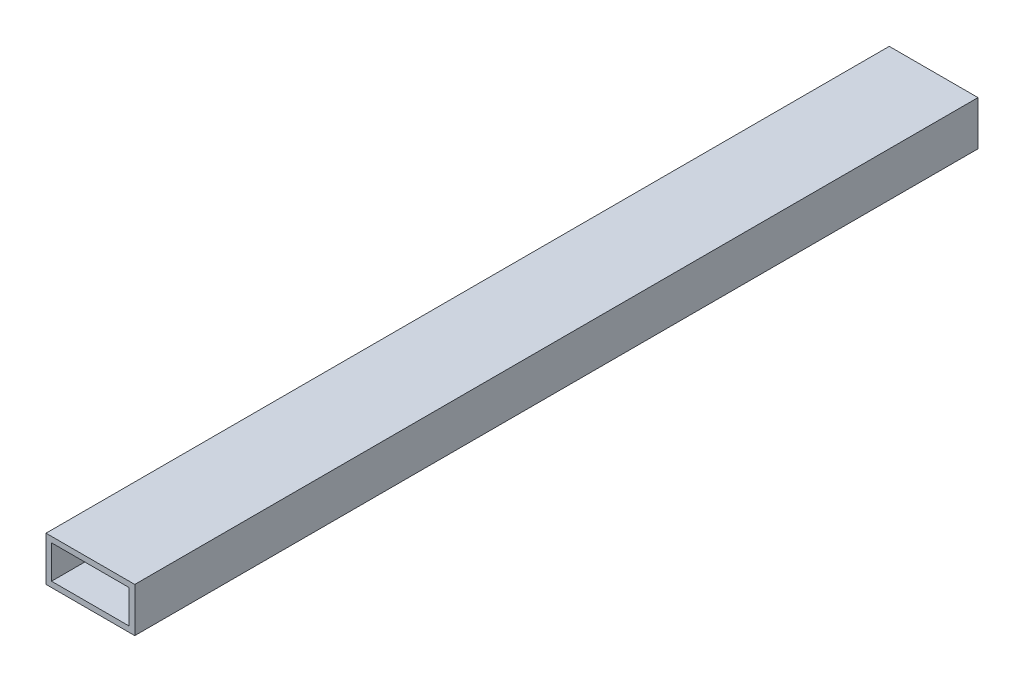
ISO-10303-21;
HEADER;
FILE_DESCRIPTION(('STEP AP214'),'2;1');
FILE_NAME('part.step','',(''),(''),'','','');
FILE_SCHEMA(('AUTOMOTIVE_DESIGN { 1 0 10303 214 1 1 1 1 }'));
ENDSEC;
DATA;
#1=APPLICATION_CONTEXT('core data for automotive mechanical design processes');
#2=APPLICATION_PROTOCOL_DEFINITION('international standard','automotive_design',2000,#1);
#3=PRODUCT_CONTEXT('',#1,'mechanical');
#4=PRODUCT('Part','Part','',(#3));
#5=PRODUCT_RELATED_PRODUCT_CATEGORY('part','',(#4));
#6=PRODUCT_DEFINITION_FORMATION('','',#4);
#7=PRODUCT_DEFINITION_CONTEXT('part definition',#1,'design');
#8=PRODUCT_DEFINITION('design','',#6,#7);
#9=PRODUCT_DEFINITION_SHAPE('','',#8);
#10=(LENGTH_UNIT() NAMED_UNIT(*) SI_UNIT(.MILLI.,.METRE.));
#11=(NAMED_UNIT(*) PLANE_ANGLE_UNIT() SI_UNIT($,.RADIAN.));
#12=(NAMED_UNIT(*) SI_UNIT($,.STERADIAN.) SOLID_ANGLE_UNIT());
#13=UNCERTAINTY_MEASURE_WITH_UNIT(LENGTH_MEASURE(1.E-05),#10,'distance_accuracy_value','');
#14=(GEOMETRIC_REPRESENTATION_CONTEXT(3) GLOBAL_UNCERTAINTY_ASSIGNED_CONTEXT((#13)) GLOBAL_UNIT_ASSIGNED_CONTEXT((#10,
#11,#12)) REPRESENTATION_CONTEXT('',''));
#15=CARTESIAN_POINT('',(0.,0.,0.));
#16=DIRECTION('',(0.,0.,1.));
#17=DIRECTION('',(1.,0.,0.));
#18=AXIS2_PLACEMENT_3D('',#15,#16,#17);
#19=CARTESIAN_POINT('',(0.,0.,482.6));
#20=DIRECTION('',(0.,0.,-1.));
#21=DIRECTION('',(-1.,0.,0.));
#22=AXIS2_PLACEMENT_3D('',#19,#20,#21);
#23=PLANE('',#22);
#24=DIRECTION('',(0.,-1.,0.));
#25=VECTOR('',#24,1.);
#26=CARTESIAN_POINT('',(0.,0.,482.6));
#27=LINE('',#26,#25);
#28=CARTESIAN_POINT('',(0.,25.4,482.6));
#29=VERTEX_POINT('',#28);
#30=CARTESIAN_POINT('',(0.,0.,482.6));
#31=VERTEX_POINT('',#30);
#32=EDGE_CURVE('E157',#29,#31,#27,.T.);
#33=ORIENTED_EDGE('',*,*,#32,.T.);
#34=DIRECTION('',(1.,0.,0.));
#35=VECTOR('',#34,1.);
#36=CARTESIAN_POINT('',(0.,0.,482.6));
#37=LINE('',#36,#35);
#38=CARTESIAN_POINT('',(50.8,0.,482.6));
#39=VERTEX_POINT('',#38);
#40=EDGE_CURVE('E161',#31,#39,#37,.T.);
#41=ORIENTED_EDGE('',*,*,#40,.T.);
#42=DIRECTION('',(0.,1.,0.));
#43=VECTOR('',#42,1.);
#44=CARTESIAN_POINT('',(50.8,0.,482.6));
#45=LINE('',#44,#43);
#46=CARTESIAN_POINT('',(50.8,25.4,482.6));
#47=VERTEX_POINT('',#46);
#48=EDGE_CURVE('E165',#39,#47,#45,.T.);
#49=ORIENTED_EDGE('',*,*,#48,.T.);
#50=DIRECTION('',(-1.,0.,0.));
#51=VECTOR('',#50,1.);
#52=CARTESIAN_POINT('',(0.,25.4,482.6));
#53=LINE('',#52,#51);
#54=EDGE_CURVE('E168',#47,#29,#53,.T.);
#55=ORIENTED_EDGE('',*,*,#54,.T.);
#56=EDGE_LOOP('',(#33,#41,#49,#55));
#57=FACE_BOUND('',#56,.T.);
#58=DIRECTION('',(0.,-1.,0.));
#59=VECTOR('',#58,1.);
#60=CARTESIAN_POINT('',(3.175,3.175,482.6));
#61=LINE('',#60,#59);
#62=CARTESIAN_POINT('',(3.175,22.225,482.6));
#63=VERTEX_POINT('',#62);
#64=CARTESIAN_POINT('',(3.175,3.175,482.6));
#65=VERTEX_POINT('',#64);
#66=EDGE_CURVE('E109',#63,#65,#61,.T.);
#67=ORIENTED_EDGE('',*,*,#66,.F.);
#68=DIRECTION('',(-1.,0.,0.));
#69=VECTOR('',#68,1.);
#70=CARTESIAN_POINT('',(3.175,22.225,482.6));
#71=LINE('',#70,#69);
#72=CARTESIAN_POINT('',(47.625,22.225,482.6));
#73=VERTEX_POINT('',#72);
#74=EDGE_CURVE('E135',#73,#63,#71,.T.);
#75=ORIENTED_EDGE('',*,*,#74,.F.);
#76=DIRECTION('',(0.,1.,0.));
#77=VECTOR('',#76,1.);
#78=CARTESIAN_POINT('',(47.625,3.175,482.6));
#79=LINE('',#78,#77);
#80=CARTESIAN_POINT('',(47.625,3.175,482.6));
#81=VERTEX_POINT('',#80);
#82=EDGE_CURVE('E131',#81,#73,#79,.T.);
#83=ORIENTED_EDGE('',*,*,#82,.F.);
#84=DIRECTION('',(1.,0.,0.));
#85=VECTOR('',#84,1.);
#86=CARTESIAN_POINT('',(3.175,3.175,482.6));
#87=LINE('',#86,#85);
#88=EDGE_CURVE('E118',#65,#81,#87,.T.);
#89=ORIENTED_EDGE('',*,*,#88,.F.);
#90=EDGE_LOOP('',(#67,#75,#83,#89));
#91=FACE_BOUND('',#90,.T.);
#92=ADVANCED_FACE('F43',(#57,#91),#23,.F.);
#93=CARTESIAN_POINT('',(0.,0.,0.));
#94=DIRECTION('',(0.,0.,-1.));
#95=DIRECTION('',(-1.,0.,0.));
#96=AXIS2_PLACEMENT_3D('',#93,#94,#95);
#97=PLANE('',#96);
#98=DIRECTION('',(0.,-1.,0.));
#99=VECTOR('',#98,1.);
#100=CARTESIAN_POINT('',(0.,0.,0.));
#101=LINE('',#100,#99);
#102=CARTESIAN_POINT('',(0.,25.4,0.));
#103=VERTEX_POINT('',#102);
#104=CARTESIAN_POINT('',(0.,0.,0.));
#105=VERTEX_POINT('',#104);
#106=EDGE_CURVE('E127',#103,#105,#101,.T.);
#107=ORIENTED_EDGE('',*,*,#106,.F.);
#108=DIRECTION('',(-1.,0.,0.));
#109=VECTOR('',#108,1.);
#110=CARTESIAN_POINT('',(0.,25.4,0.));
#111=LINE('',#110,#109);
#112=CARTESIAN_POINT('',(50.8,25.4,0.));
#113=VERTEX_POINT('',#112);
#114=EDGE_CURVE('E162',#113,#103,#111,.T.);
#115=ORIENTED_EDGE('',*,*,#114,.F.);
#116=DIRECTION('',(0.,1.,0.));
#117=VECTOR('',#116,1.);
#118=CARTESIAN_POINT('',(50.8,0.,0.));
#119=LINE('',#118,#117);
#120=CARTESIAN_POINT('',(50.8,0.,0.));
#121=VERTEX_POINT('',#120);
#122=EDGE_CURVE('E178',#121,#113,#119,.T.);
#123=ORIENTED_EDGE('',*,*,#122,.F.);
#124=DIRECTION('',(1.,0.,0.));
#125=VECTOR('',#124,1.);
#126=CARTESIAN_POINT('',(0.,0.,0.));
#127=LINE('',#126,#125);
#128=EDGE_CURVE('E175',#105,#121,#127,.T.);
#129=ORIENTED_EDGE('',*,*,#128,.F.);
#130=EDGE_LOOP('',(#107,#115,#123,#129));
#131=FACE_BOUND('',#130,.T.);
#132=DIRECTION('',(-1.,0.,0.));
#133=VECTOR('',#132,1.);
#134=CARTESIAN_POINT('',(3.175,22.225,0.));
#135=LINE('',#134,#133);
#136=CARTESIAN_POINT('',(47.625,22.225,0.));
#137=VERTEX_POINT('',#136);
#138=CARTESIAN_POINT('',(3.175,22.225,0.));
#139=VERTEX_POINT('',#138);
#140=EDGE_CURVE('E119',#137,#139,#135,.T.);
#141=ORIENTED_EDGE('',*,*,#140,.T.);
#142=DIRECTION('',(0.,-1.,0.));
#143=VECTOR('',#142,1.);
#144=CARTESIAN_POINT('',(3.175,3.175,0.));
#145=LINE('',#144,#143);
#146=CARTESIAN_POINT('',(3.175,3.175,0.));
#147=VERTEX_POINT('',#146);
#148=EDGE_CURVE('E67',#139,#147,#145,.T.);
#149=ORIENTED_EDGE('',*,*,#148,.T.);
#150=DIRECTION('',(1.,0.,0.));
#151=VECTOR('',#150,1.);
#152=CARTESIAN_POINT('',(3.175,3.175,0.));
#153=LINE('',#152,#151);
#154=CARTESIAN_POINT('',(47.625,3.175,0.));
#155=VERTEX_POINT('',#154);
#156=EDGE_CURVE('E125',#147,#155,#153,.T.);
#157=ORIENTED_EDGE('',*,*,#156,.T.);
#158=DIRECTION('',(0.,1.,0.));
#159=VECTOR('',#158,1.);
#160=CARTESIAN_POINT('',(47.625,3.175,0.));
#161=LINE('',#160,#159);
#162=EDGE_CURVE('E144',#155,#137,#161,.T.);
#163=ORIENTED_EDGE('',*,*,#162,.T.);
#164=EDGE_LOOP('',(#141,#149,#157,#163));
#165=FACE_BOUND('',#164,.T.);
#166=ADVANCED_FACE('F201',(#131,#165),#97,.T.);
#167=CARTESIAN_POINT('',(0.,0.,482.6));
#168=DIRECTION('',(1.,0.,0.));
#169=DIRECTION('',(0.,0.,-1.));
#170=AXIS2_PLACEMENT_3D('',#167,#168,#169);
#171=PLANE('',#170);
#172=ORIENTED_EDGE('',*,*,#106,.T.);
#173=DIRECTION('',(0.,0.,-1.));
#174=VECTOR('',#173,1.);
#175=CARTESIAN_POINT('',(0.,0.,482.6));
#176=LINE('',#175,#174);
#177=EDGE_CURVE('E11',#31,#105,#176,.T.);
#178=ORIENTED_EDGE('',*,*,#177,.F.);
#179=ORIENTED_EDGE('',*,*,#32,.F.);
#180=DIRECTION('',(0.,0.,-1.));
#181=VECTOR('',#180,1.);
#182=CARTESIAN_POINT('',(0.,25.4,482.6));
#183=LINE('',#182,#181);
#184=EDGE_CURVE('E171',#29,#103,#183,.T.);
#185=ORIENTED_EDGE('',*,*,#184,.T.);
#186=EDGE_LOOP('',(#172,#178,#179,#185));
#187=FACE_BOUND('',#186,.T.);
#188=ADVANCED_FACE('F45',(#187),#171,.F.);
#189=CARTESIAN_POINT('',(0.,0.,482.6));
#190=DIRECTION('',(0.,1.,0.));
#191=DIRECTION('',(0.,0.,1.));
#192=AXIS2_PLACEMENT_3D('',#189,#190,#191);
#193=PLANE('',#192);
#194=ORIENTED_EDGE('',*,*,#128,.T.);
#195=DIRECTION('',(0.,0.,-1.));
#196=VECTOR('',#195,1.);
#197=CARTESIAN_POINT('',(50.8,0.,482.6));
#198=LINE('',#197,#196);
#199=EDGE_CURVE('E52',#39,#121,#198,.T.);
#200=ORIENTED_EDGE('',*,*,#199,.F.);
#201=ORIENTED_EDGE('',*,*,#40,.F.);
#202=ORIENTED_EDGE('',*,*,#177,.T.);
#203=EDGE_LOOP('',(#194,#200,#201,#202));
#204=FACE_BOUND('',#203,.T.);
#205=ADVANCED_FACE('F211',(#204),#193,.F.);
#206=CARTESIAN_POINT('',(50.8,0.,482.6));
#207=DIRECTION('',(-1.,0.,0.));
#208=DIRECTION('',(0.,0.,1.));
#209=AXIS2_PLACEMENT_3D('',#206,#207,#208);
#210=PLANE('',#209);
#211=ORIENTED_EDGE('',*,*,#122,.T.);
#212=DIRECTION('',(0.,0.,-1.));
#213=VECTOR('',#212,1.);
#214=CARTESIAN_POINT('',(50.8,25.4,482.6));
#215=LINE('',#214,#213);
#216=EDGE_CURVE('E186',#47,#113,#215,.T.);
#217=ORIENTED_EDGE('',*,*,#216,.F.);
#218=ORIENTED_EDGE('',*,*,#48,.F.);
#219=ORIENTED_EDGE('',*,*,#199,.T.);
#220=EDGE_LOOP('',(#211,#217,#218,#219));
#221=FACE_BOUND('',#220,.T.);
#222=ADVANCED_FACE('F195',(#221),#210,.F.);
#223=CARTESIAN_POINT('',(0.,25.4,482.6));
#224=DIRECTION('',(0.,-1.,0.));
#225=DIRECTION('',(0.,0.,-1.));
#226=AXIS2_PLACEMENT_3D('',#223,#224,#225);
#227=PLANE('',#226);
#228=ORIENTED_EDGE('',*,*,#114,.T.);
#229=ORIENTED_EDGE('',*,*,#184,.F.);
#230=ORIENTED_EDGE('',*,*,#54,.F.);
#231=ORIENTED_EDGE('',*,*,#216,.T.);
#232=EDGE_LOOP('',(#228,#229,#230,#231));
#233=FACE_BOUND('',#232,.T.);
#234=ADVANCED_FACE('F205',(#233),#227,.F.);
#235=CARTESIAN_POINT('',(3.175,3.175,482.6));
#236=DIRECTION('',(1.,0.,0.));
#237=DIRECTION('',(0.,0.,-1.));
#238=AXIS2_PLACEMENT_3D('',#235,#236,#237);
#239=PLANE('',#238);
#240=ORIENTED_EDGE('',*,*,#148,.F.);
#241=DIRECTION('',(0.,0.,-1.));
#242=VECTOR('',#241,1.);
#243=CARTESIAN_POINT('',(3.175,22.225,482.6));
#244=LINE('',#243,#242);
#245=EDGE_CURVE('E113',#63,#139,#244,.T.);
#246=ORIENTED_EDGE('',*,*,#245,.F.);
#247=ORIENTED_EDGE('',*,*,#66,.T.);
#248=DIRECTION('',(0.,0.,-1.));
#249=VECTOR('',#248,1.);
#250=CARTESIAN_POINT('',(3.175,3.175,482.6));
#251=LINE('',#250,#249);
#252=EDGE_CURVE('E112',#65,#147,#251,.T.);
#253=ORIENTED_EDGE('',*,*,#252,.T.);
#254=EDGE_LOOP('',(#240,#246,#247,#253));
#255=FACE_BOUND('',#254,.T.);
#256=ADVANCED_FACE('F111',(#255),#239,.T.);
#257=CARTESIAN_POINT('',(3.175,3.175,482.6));
#258=DIRECTION('',(0.,1.,0.));
#259=DIRECTION('',(0.,0.,1.));
#260=AXIS2_PLACEMENT_3D('',#257,#258,#259);
#261=PLANE('',#260);
#262=ORIENTED_EDGE('',*,*,#156,.F.);
#263=ORIENTED_EDGE('',*,*,#252,.F.);
#264=ORIENTED_EDGE('',*,*,#88,.T.);
#265=DIRECTION('',(0.,0.,-1.));
#266=VECTOR('',#265,1.);
#267=CARTESIAN_POINT('',(47.625,3.175,482.6));
#268=LINE('',#267,#266);
#269=EDGE_CURVE('E128',#81,#155,#268,.T.);
#270=ORIENTED_EDGE('',*,*,#269,.T.);
#271=EDGE_LOOP('',(#262,#263,#264,#270));
#272=FACE_BOUND('',#271,.T.);
#273=ADVANCED_FACE('F122',(#272),#261,.T.);
#274=CARTESIAN_POINT('',(47.625,3.175,482.6));
#275=DIRECTION('',(-1.,0.,0.));
#276=DIRECTION('',(0.,0.,1.));
#277=AXIS2_PLACEMENT_3D('',#274,#275,#276);
#278=PLANE('',#277);
#279=ORIENTED_EDGE('',*,*,#162,.F.);
#280=ORIENTED_EDGE('',*,*,#269,.F.);
#281=ORIENTED_EDGE('',*,*,#82,.T.);
#282=DIRECTION('',(0.,0.,-1.));
#283=VECTOR('',#282,1.);
#284=CARTESIAN_POINT('',(47.625,22.225,482.6));
#285=LINE('',#284,#283);
#286=EDGE_CURVE('E59',#73,#137,#285,.T.);
#287=ORIENTED_EDGE('',*,*,#286,.T.);
#288=EDGE_LOOP('',(#279,#280,#281,#287));
#289=FACE_BOUND('',#288,.T.);
#290=ADVANCED_FACE('F234',(#289),#278,.T.);
#291=CARTESIAN_POINT('',(3.175,22.225,482.6));
#292=DIRECTION('',(0.,-1.,0.));
#293=DIRECTION('',(0.,0.,-1.));
#294=AXIS2_PLACEMENT_3D('',#291,#292,#293);
#295=PLANE('',#294);
#296=ORIENTED_EDGE('',*,*,#140,.F.);
#297=ORIENTED_EDGE('',*,*,#286,.F.);
#298=ORIENTED_EDGE('',*,*,#74,.T.);
#299=ORIENTED_EDGE('',*,*,#245,.T.);
#300=EDGE_LOOP('',(#296,#297,#298,#299));
#301=FACE_BOUND('',#300,.T.);
#302=ADVANCED_FACE('F238',(#301),#295,.T.);
#303=CLOSED_SHELL('',(#92,#166,#188,#205,#222,#234,#256,#273,#290,#302));
#304=MANIFOLD_SOLID_BREP('B2',#303);
#305=ADVANCED_BREP_SHAPE_REPRESENTATION('',(#18,#304),#14);
#306=SHAPE_DEFINITION_REPRESENTATION(#9,#305);
ENDSEC;
END-ISO-10303-21;
